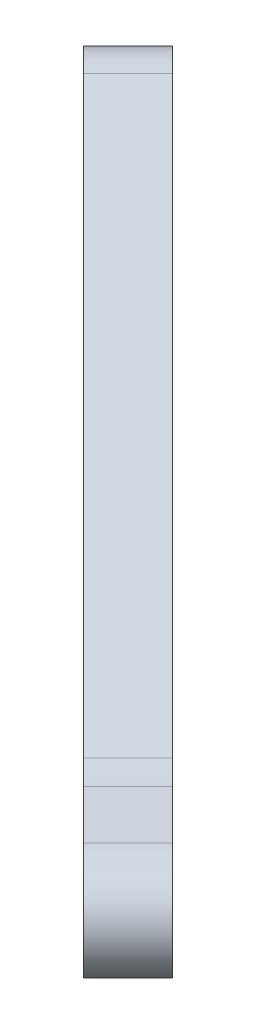
ISO-10303-21;
HEADER;
FILE_DESCRIPTION(('STEP AP214'),'2;1');
FILE_NAME('part.step','',(''),(''),'','','');
FILE_SCHEMA(('AUTOMOTIVE_DESIGN { 1 0 10303 214 1 1 1 1 }'));
ENDSEC;
DATA;
#1=APPLICATION_CONTEXT('core data for automotive mechanical design processes');
#2=APPLICATION_PROTOCOL_DEFINITION('international standard','automotive_design',2000,#1);
#3=PRODUCT_CONTEXT('',#1,'mechanical');
#4=PRODUCT('Part','Part','',(#3));
#5=PRODUCT_RELATED_PRODUCT_CATEGORY('part','',(#4));
#6=PRODUCT_DEFINITION_FORMATION('','',#4);
#7=PRODUCT_DEFINITION_CONTEXT('part definition',#1,'design');
#8=PRODUCT_DEFINITION('design','',#6,#7);
#9=PRODUCT_DEFINITION_SHAPE('','',#8);
#10=(LENGTH_UNIT() NAMED_UNIT(*) SI_UNIT(.MILLI.,.METRE.));
#11=(NAMED_UNIT(*) PLANE_ANGLE_UNIT() SI_UNIT($,.RADIAN.));
#12=(NAMED_UNIT(*) SI_UNIT($,.STERADIAN.) SOLID_ANGLE_UNIT());
#13=UNCERTAINTY_MEASURE_WITH_UNIT(LENGTH_MEASURE(1.E-05),#10,'distance_accuracy_value','');
#14=(GEOMETRIC_REPRESENTATION_CONTEXT(3) GLOBAL_UNCERTAINTY_ASSIGNED_CONTEXT((#13)) GLOBAL_UNIT_ASSIGNED_CONTEXT((#10,
#11,#12)) REPRESENTATION_CONTEXT('',''));
#15=CARTESIAN_POINT('',(0.,0.,0.));
#16=DIRECTION('',(0.,0.,1.));
#17=DIRECTION('',(1.,0.,0.));
#18=AXIS2_PLACEMENT_3D('',#15,#16,#17);
#19=CARTESIAN_POINT('',(-52.7599580016663,-1.60288568297003,29.4826826854525));
#20=DIRECTION('',(0.707106781186551,0.,-0.707106781186544));
#21=DIRECTION('',(-0.707106781186544,0.,-0.707106781186551));
#22=AXIS2_PLACEMENT_3D('',#19,#20,#21);
#23=CYLINDRICAL_SURFACE('',#22,4.);
#24=CARTESIAN_POINT('',(-50.6386376581066,-1.60288568297003,27.3613623418928));
#25=DIRECTION('',(0.707106781186551,0.,-0.707106781186544));
#26=DIRECTION('',(-0.707106781186544,0.,-0.707106781186551));
#27=AXIS2_PLACEMENT_3D('',#24,#25,#26);
#28=CIRCLE('',#27,4.);
#29=CARTESIAN_POINT('',(-52.1460159613578,1.78172970164536,25.8539840386417));
#30=VERTEX_POINT('',#29);
#31=CARTESIAN_POINT('',(-48.2974525519035,0.641597463989556,29.702547448096));
#32=VERTEX_POINT('',#31);
#33=EDGE_CURVE('E155',#30,#32,#28,.T.);
#34=ORIENTED_EDGE('',*,*,#33,.T.);
#35=DIRECTION('',(0.707106781186551,0.,-0.707106781186544));
#36=VECTOR('',#35,1.);
#37=CARTESIAN_POINT('',(-50.4187728954632,0.641597463989555,31.8238677916556));
#38=LINE('',#37,#36);
#39=CARTESIAN_POINT('',(-50.4187728954632,0.641597463989555,31.8238677916556));
#40=VERTEX_POINT('',#39);
#41=EDGE_CURVE('E53',#32,#40,#38,.F.);
#42=ORIENTED_EDGE('',*,*,#41,.T.);
#43=CARTESIAN_POINT('',(-52.7599580016663,-1.60288568297003,29.4826826854525));
#44=DIRECTION('',(0.707106781186551,0.,-0.707106781186544));
#45=DIRECTION('',(-0.707106781186544,0.,-0.707106781186551));
#46=AXIS2_PLACEMENT_3D('',#43,#44,#45);
#47=CIRCLE('',#46,4.);
#48=CARTESIAN_POINT('',(-54.2673363049175,1.78172970164536,27.9753043822013));
#49=VERTEX_POINT('',#48);
#50=EDGE_CURVE('E128',#49,#40,#47,.T.);
#51=ORIENTED_EDGE('',*,*,#50,.F.);
#52=DIRECTION('',(0.707106781186551,0.,-0.707106781186544));
#53=VECTOR('',#52,1.);
#54=CARTESIAN_POINT('',(-54.2673363049175,1.78172970164536,27.9753043822013));
#55=LINE('',#54,#53);
#56=EDGE_CURVE('E117',#49,#30,#55,.T.);
#57=ORIENTED_EDGE('',*,*,#56,.T.);
#58=EDGE_LOOP('',(#34,#42,#51,#57));
#59=FACE_BOUND('',#58,.T.);
#60=ADVANCED_FACE('F38',(#59),#23,.F.);
#61=CARTESIAN_POINT('',(-41.9007915415534,-3.95038970101181,40.3418491455654));
#62=DIRECTION('',(-0.190054282091461,-0.963202335813923,-0.190054282091463));
#63=DIRECTION('',(0.,0.19358259911083,-0.981083980768974));
#64=AXIS2_PLACEMENT_3D('',#61,#62,#63);
#65=PLANE('',#64);
#66=DIRECTION('',(-0.681086903308744,0.268777343320827,-0.681086903308751));
#67=VECTOR('',#66,1.);
#68=CARTESIAN_POINT('',(-39.7794711979938,-3.95038970101181,38.2205288020058));
#69=LINE('',#68,#67);
#70=CARTESIAN_POINT('',(-32.5179305674683,-6.81601167906962,45.4820694325313));
#71=VERTEX_POINT('',#70);
#72=CARTESIAN_POINT('',(-46.321242579607,-1.36881028138058,31.6787574203925));
#73=VERTEX_POINT('',#72);
#74=EDGE_CURVE('E169',#71,#73,#69,.T.);
#75=ORIENTED_EDGE('',*,*,#74,.F.);
#76=DIRECTION('',(0.707106781186551,0.,-0.707106781186544));
#77=VECTOR('',#76,1.);
#78=CARTESIAN_POINT('',(-34.639250911028,-6.81601167906962,47.6033897760909));
#79=LINE('',#78,#77);
#80=CARTESIAN_POINT('',(-34.639250911028,-6.81601167906962,47.6033897760909));
#81=VERTEX_POINT('',#80);
#82=EDGE_CURVE('E197',#71,#81,#79,.F.);
#83=ORIENTED_EDGE('',*,*,#82,.T.);
#84=DIRECTION('',(-0.681086903308744,0.268777343320827,-0.681086903308751));
#85=VECTOR('',#84,1.);
#86=CARTESIAN_POINT('',(-41.9007915415534,-3.95038970101181,40.3418491455654));
#87=LINE('',#86,#85);
#88=CARTESIAN_POINT('',(-48.4425629231667,-1.36881028138058,33.8000777639522));
#89=VERTEX_POINT('',#88);
#90=EDGE_CURVE('E148',#81,#89,#87,.T.);
#91=ORIENTED_EDGE('',*,*,#90,.T.);
#92=DIRECTION('',(-0.707106781186551,0.,0.707106781186544));
#93=VECTOR('',#92,1.);
#94=CARTESIAN_POINT('',(-46.321242579607,-1.36881028138058,31.6787574203925));
#95=LINE('',#94,#93);
#96=EDGE_CURVE('E194',#89,#73,#95,.F.);
#97=ORIENTED_EDGE('',*,*,#96,.T.);
#98=EDGE_LOOP('',(#75,#83,#91,#97));
#99=FACE_BOUND('',#98,.T.);
#100=ADVANCED_FACE('F223',(#99),#65,.T.);
#101=CARTESIAN_POINT('',(-41.1213203435597,-7.,41.1213203435592));
#102=DIRECTION('',(0.,-1.,0.));
#103=DIRECTION('',(0.,0.,-1.));
#104=AXIS2_PLACEMENT_3D('',#101,#102,#103);
#105=PLANE('',#104);
#106=DIRECTION('',(-0.707106781186544,0.,-0.707106781186551));
#107=VECTOR('',#106,1.);
#108=CARTESIAN_POINT('',(-41.1213203435597,-7.,41.1213203435592));
#109=LINE('',#108,#107);
#110=CARTESIAN_POINT('',(-31.3445938794036,-7.,50.8980468077154));
#111=VERTEX_POINT('',#110);
#112=CARTESIAN_POINT('',(-33.6889795005707,-7.,48.5536611865483));
#113=VERTEX_POINT('',#112);
#114=EDGE_CURVE('E145',#111,#113,#109,.T.);
#115=ORIENTED_EDGE('',*,*,#114,.T.);
#116=DIRECTION('',(0.707106781186551,0.,-0.707106781186544));
#117=VECTOR('',#116,1.);
#118=CARTESIAN_POINT('',(-33.6889795005707,-7.,48.5536611865483));
#119=LINE('',#118,#117);
#120=CARTESIAN_POINT('',(-31.567659157011,-7.,46.4323408429886));
#121=VERTEX_POINT('',#120);
#122=EDGE_CURVE('E187',#113,#121,#119,.T.);
#123=ORIENTED_EDGE('',*,*,#122,.T.);
#124=DIRECTION('',(-0.707106781186544,0.,-0.707106781186551));
#125=VECTOR('',#124,1.);
#126=CARTESIAN_POINT('',(-39.,-7.,38.9999999999996));
#127=LINE('',#126,#125);
#128=CARTESIAN_POINT('',(-29.2232735358439,-7.,48.7767264641558));
#129=VERTEX_POINT('',#128);
#130=EDGE_CURVE('E166',#129,#121,#127,.T.);
#131=ORIENTED_EDGE('',*,*,#130,.F.);
#132=DIRECTION('',(0.707106781186551,0.,-0.707106781186544));
#133=VECTOR('',#132,1.);
#134=CARTESIAN_POINT('',(-31.3445938794036,-7.,50.8980468077154));
#135=LINE('',#134,#133);
#136=EDGE_CURVE('E177',#111,#129,#135,.T.);
#137=ORIENTED_EDGE('',*,*,#136,.F.);
#138=EDGE_LOOP('',(#115,#123,#131,#137));
#139=FACE_BOUND('',#138,.T.);
#140=ADVANCED_FACE('F231',(#139),#105,.T.);
#141=CARTESIAN_POINT('',(-31.3445938794036,-4.5,50.8980468077154));
#142=DIRECTION('',(0.707106781186551,0.,-0.707106781186544));
#143=DIRECTION('',(-0.707106781186544,0.,-0.707106781186551));
#144=AXIS2_PLACEMENT_3D('',#141,#142,#143);
#145=CYLINDRICAL_SURFACE('',#144,2.5);
#146=CARTESIAN_POINT('',(-29.2232735358439,-4.5,48.7767264641558));
#147=DIRECTION('',(0.707106781186551,0.,-0.707106781186544));
#148=DIRECTION('',(-0.707106781186544,0.,-0.707106781186551));
#149=AXIS2_PLACEMENT_3D('',#146,#147,#148);
#150=CIRCLE('',#149,2.5);
#151=CARTESIAN_POINT('',(-29.2232735358439,-2.,48.7767264641558));
#152=VERTEX_POINT('',#151);
#153=EDGE_CURVE('E163',#152,#129,#150,.T.);
#154=ORIENTED_EDGE('',*,*,#153,.F.);
#155=DIRECTION('',(0.707106781186551,0.,-0.707106781186544));
#156=VECTOR('',#155,1.);
#157=CARTESIAN_POINT('',(-31.3445938794036,-2.,50.8980468077154));
#158=LINE('',#157,#156);
#159=CARTESIAN_POINT('',(-31.3445938794036,-2.,50.8980468077154));
#160=VERTEX_POINT('',#159);
#161=EDGE_CURVE('E180',#160,#152,#158,.T.);
#162=ORIENTED_EDGE('',*,*,#161,.F.);
#163=CARTESIAN_POINT('',(-31.3445938794036,-4.5,50.8980468077154));
#164=DIRECTION('',(0.707106781186551,0.,-0.707106781186544));
#165=DIRECTION('',(-0.707106781186544,0.,-0.707106781186551));
#166=AXIS2_PLACEMENT_3D('',#163,#164,#165);
#167=CIRCLE('',#166,2.5);
#168=EDGE_CURVE('E142',#160,#111,#167,.T.);
#169=ORIENTED_EDGE('',*,*,#168,.T.);
#170=ORIENTED_EDGE('',*,*,#136,.T.);
#171=EDGE_LOOP('',(#154,#162,#169,#170));
#172=FACE_BOUND('',#171,.T.);
#173=ADVANCED_FACE('F234',(#172),#145,.T.);
#174=CARTESIAN_POINT('',(-41.1213203435597,-2.,41.1213203435592));
#175=DIRECTION('',(0.,-1.,0.));
#176=DIRECTION('',(0.,0.,-1.));
#177=AXIS2_PLACEMENT_3D('',#174,#175,#176);
#178=PLANE('',#177);
#179=DIRECTION('',(-0.707106781186544,0.,-0.707106781186551));
#180=VECTOR('',#179,1.);
#181=CARTESIAN_POINT('',(-39.,-2.,38.9999999999996));
#182=LINE('',#181,#180);
#183=CARTESIAN_POINT('',(-31.5566948650642,-2.,46.4433051349355));
#184=VERTEX_POINT('',#183);
#185=EDGE_CURVE('E160',#152,#184,#182,.T.);
#186=ORIENTED_EDGE('',*,*,#185,.T.);
#187=DIRECTION('',(0.707106781186551,0.,-0.707106781186544));
#188=VECTOR('',#187,1.);
#189=CARTESIAN_POINT('',(-33.6780152086239,-2.,48.5646254784951));
#190=LINE('',#189,#188);
#191=CARTESIAN_POINT('',(-33.6780152086239,-2.,48.5646254784951));
#192=VERTEX_POINT('',#191);
#193=EDGE_CURVE('E185',#184,#192,#190,.F.);
#194=ORIENTED_EDGE('',*,*,#193,.T.);
#195=DIRECTION('',(-0.707106781186544,0.,-0.707106781186551));
#196=VECTOR('',#195,1.);
#197=CARTESIAN_POINT('',(-41.1213203435597,-2.,41.1213203435592));
#198=LINE('',#197,#196);
#199=EDGE_CURVE('E137',#160,#192,#198,.T.);
#200=ORIENTED_EDGE('',*,*,#199,.F.);
#201=ORIENTED_EDGE('',*,*,#161,.T.);
#202=EDGE_LOOP('',(#186,#194,#200,#201));
#203=FACE_BOUND('',#202,.T.);
#204=ADVANCED_FACE('F212',(#203),#178,.F.);
#205=CARTESIAN_POINT('',(-40.9707098485691,0.745739546238239,41.2719308385498));
#206=DIRECTION('',(-0.194195606788689,-0.961548819669571,-0.194195606788691));
#207=DIRECTION('',(0.,0.197964287341307,-0.980209233244336));
#208=AXIS2_PLACEMENT_3D('',#205,#206,#207);
#209=PLANE('',#208);
#210=DIRECTION('',(-0.679917690830271,0.274634060873839,-0.679917690830278));
#211=VECTOR('',#210,1.);
#212=CARTESIAN_POINT('',(-40.9707098485691,0.745739546238239,41.2719308385498));
#213=LINE('',#212,#211);
#214=CARTESIAN_POINT('',(-34.6489932425673,-1.80774409834785,47.5936474445516));
#215=VERTEX_POINT('',#214);
#216=CARTESIAN_POINT('',(-54.7239587274777,6.3009863662039,27.518681959641));
#217=VERTEX_POINT('',#216);
#218=EDGE_CURVE('E134',#215,#217,#213,.T.);
#219=ORIENTED_EDGE('',*,*,#218,.F.);
#220=DIRECTION('',(0.707106781186551,0.,-0.707106781186544));
#221=VECTOR('',#220,1.);
#222=CARTESIAN_POINT('',(-32.5276728990077,-1.80774409834785,45.472327100992));
#223=LINE('',#222,#221);
#224=CARTESIAN_POINT('',(-32.5276728990077,-1.80774409834785,45.472327100992));
#225=VERTEX_POINT('',#224);
#226=EDGE_CURVE('E179',#215,#225,#223,.T.);
#227=ORIENTED_EDGE('',*,*,#226,.T.);
#228=DIRECTION('',(-0.679917690830271,0.274634060873839,-0.679917690830278));
#229=VECTOR('',#228,1.);
#230=CARTESIAN_POINT('',(-38.8493895050094,0.745739546238239,39.1506104949902));
#231=LINE('',#230,#229);
#232=CARTESIAN_POINT('',(-52.6026383839181,6.3009863662039,25.3973616160814));
#233=VERTEX_POINT('',#232);
#234=EDGE_CURVE('E158',#225,#233,#231,.T.);
#235=ORIENTED_EDGE('',*,*,#234,.T.);
#236=DIRECTION('',(0.707106781186551,0.,-0.707106781186544));
#237=VECTOR('',#236,1.);
#238=CARTESIAN_POINT('',(-54.7239587274777,6.3009863662039,27.518681959641));
#239=LINE('',#238,#237);
#240=EDGE_CURVE('E125',#217,#233,#239,.T.);
#241=ORIENTED_EDGE('',*,*,#240,.F.);
#242=EDGE_LOOP('',(#219,#227,#235,#241));
#243=FACE_BOUND('',#242,.T.);
#244=ADVANCED_FACE('F218',(#243),#209,.F.);
#245=CARTESIAN_POINT('',(-31.3445938794036,-4.5,50.8980468077154));
#246=DIRECTION('',(0.707106781186551,0.,-0.707106781186544));
#247=DIRECTION('',(-0.707106781186544,0.,-0.707106781186551));
#248=AXIS2_PLACEMENT_3D('',#245,#246,#247);
#249=CYLINDRICAL_SURFACE('',#248,1.2);
#250=CARTESIAN_POINT('',(-31.3445938794036,-4.5,50.8980468077154));
#251=DIRECTION('',(0.707106781186551,0.,-0.707106781186544));
#252=DIRECTION('',(-0.707106781186544,0.,-0.707106781186551));
#253=AXIS2_PLACEMENT_3D('',#250,#251,#252);
#254=CIRCLE('',#253,1.2);
#255=CARTESIAN_POINT('',(-32.1931220168274,-4.5,50.0495186702915));
#256=VERTEX_POINT('',#255);
#257=EDGE_CURVE('E150',#256,#256,#254,.T.);
#258=CARTESIAN_POINT('',(-29.2232735358439,-4.5,48.7767264641558));
#259=DIRECTION('',(0.707106781186551,0.,-0.707106781186544));
#260=DIRECTION('',(-0.707106781186544,0.,-0.707106781186551));
#261=AXIS2_PLACEMENT_3D('',#258,#259,#260);
#262=CIRCLE('',#261,1.2);
#263=CARTESIAN_POINT('',(-30.0718016732678,-4.5,47.9281983267319));
#264=VERTEX_POINT('',#263);
#265=EDGE_CURVE('E172',#264,#264,#262,.T.);
#266=CARTESIAN_POINT('',(-32.1931220168274,-4.5,50.0495186702915));
#267=CARTESIAN_POINT('',(-32.1710249299154,-4.5,50.0274215833794));
#268=CARTESIAN_POINT('',(-32.1489278430033,-4.5,50.0053244964674));
#269=CARTESIAN_POINT('',(-32.1047336691791,-4.5,49.9611303226432));
#270=CARTESIAN_POINT('',(-32.082636582267,-4.5,49.9390332357311));
#271=CARTESIAN_POINT('',(-32.0384424084429,-4.5,49.894839061907));
#272=CARTESIAN_POINT('',(-32.0163453215308,-4.5,49.8727419749949));
#273=CARTESIAN_POINT('',(-31.9721511477067,-4.5,49.8285478011707));
#274=CARTESIAN_POINT('',(-31.9500540607946,-4.5,49.8064507142587));
#275=CARTESIAN_POINT('',(-31.9058598869704,-4.5,49.7622565404345));
#276=CARTESIAN_POINT('',(-31.8837628000583,-4.5,49.7401594535224));
#277=CARTESIAN_POINT('',(-31.8395686262342,-4.5,49.6959652796983));
#278=CARTESIAN_POINT('',(-31.8174715393221,-4.5,49.6738681927862));
#279=CARTESIAN_POINT('',(-31.7732773654979,-4.5,49.629674018962));
#280=CARTESIAN_POINT('',(-31.7511802785859,-4.5,49.6075769320499));
#281=CARTESIAN_POINT('',(-31.7069861047617,-4.5,49.5633827582258));
#282=CARTESIAN_POINT('',(-31.6848890178496,-4.5,49.5412856713137));
#283=CARTESIAN_POINT('',(-31.6406948440255,-4.5,49.4970914974895));
#284=CARTESIAN_POINT('',(-31.6185977571134,-4.5,49.4749944105775));
#285=CARTESIAN_POINT('',(-31.5744035832892,-4.5,49.4308002367533));
#286=CARTESIAN_POINT('',(-31.5523064963771,-4.5,49.4087031498412));
#287=CARTESIAN_POINT('',(-31.508112322553,-4.5,49.3645089760171));
#288=CARTESIAN_POINT('',(-31.4860152356409,-4.5,49.342411889105));
#289=CARTESIAN_POINT('',(-31.4418210618167,-4.5,49.2982177152808));
#290=CARTESIAN_POINT('',(-31.4197239749047,-4.5,49.2761206283688));
#291=CARTESIAN_POINT('',(-31.3755298010805,-4.5,49.2319264545446));
#292=CARTESIAN_POINT('',(-31.3534327141684,-4.5,49.2098293676325));
#293=CARTESIAN_POINT('',(-31.3092385403443,-4.5,49.1656351938084));
#294=CARTESIAN_POINT('',(-31.2871414534322,-4.5,49.1435381068963));
#295=CARTESIAN_POINT('',(-31.242947279608,-4.5,49.0993439330721));
#296=CARTESIAN_POINT('',(-31.2208501926959,-4.5,49.07724684616));
#297=CARTESIAN_POINT('',(-31.1766560188718,-4.5,49.0330526723359));
#298=CARTESIAN_POINT('',(-31.1545589319597,-4.5,49.0109555854238));
#299=CARTESIAN_POINT('',(-31.1103647581355,-4.5,48.9667614115996));
#300=CARTESIAN_POINT('',(-31.0882676712235,-4.5,48.9446643246876));
#301=CARTESIAN_POINT('',(-31.0440734973993,-4.5,48.9004701508634));
#302=CARTESIAN_POINT('',(-31.0219764104872,-4.5,48.8783730639513));
#303=CARTESIAN_POINT('',(-30.9777822366631,-4.5,48.8341788901272));
#304=CARTESIAN_POINT('',(-30.955685149751,-4.5,48.8120818032151));
#305=CARTESIAN_POINT('',(-30.9114909759268,-4.5,48.7678876293909));
#306=CARTESIAN_POINT('',(-30.8893938890147,-4.5,48.7457905424788));
#307=CARTESIAN_POINT('',(-30.8451997151906,-4.5,48.7015963686547));
#308=CARTESIAN_POINT('',(-30.8231026282785,-4.5,48.6794992817426));
#309=CARTESIAN_POINT('',(-30.7789084544543,-4.5,48.6353051079184));
#310=CARTESIAN_POINT('',(-30.7568113675423,-4.5,48.6132080210064));
#311=CARTESIAN_POINT('',(-30.7126171937181,-4.5,48.5690138471822));
#312=CARTESIAN_POINT('',(-30.690520106806,-4.5,48.5469167602701));
#313=CARTESIAN_POINT('',(-30.6463259329819,-4.5,48.502722586446));
#314=CARTESIAN_POINT('',(-30.6242288460698,-4.5,48.4806254995339));
#315=CARTESIAN_POINT('',(-30.5800346722456,-4.5,48.4364313257097));
#316=CARTESIAN_POINT('',(-30.5579375853335,-4.5,48.4143342387977));
#317=CARTESIAN_POINT('',(-30.5137434115094,-4.5,48.3701400649735));
#318=CARTESIAN_POINT('',(-30.4916463245973,-4.5,48.3480429780614));
#319=CARTESIAN_POINT('',(-30.4474521507732,-4.5,48.3038488042373));
#320=CARTESIAN_POINT('',(-30.4253550638611,-4.5,48.2817517173252));
#321=CARTESIAN_POINT('',(-30.3811608900369,-4.5,48.237557543501));
#322=CARTESIAN_POINT('',(-30.3590638031248,-4.5,48.2154604565889));
#323=CARTESIAN_POINT('',(-30.3148696293007,-4.5,48.1712662827648));
#324=CARTESIAN_POINT('',(-30.2927725423886,-4.5,48.1491691958527));
#325=CARTESIAN_POINT('',(-30.2485783685644,-4.5,48.1049750220285));
#326=CARTESIAN_POINT('',(-30.2264812816524,-4.5,48.0828779351165));
#327=CARTESIAN_POINT('',(-30.1822871078282,-4.5,48.0386837612923));
#328=CARTESIAN_POINT('',(-30.1601900209161,-4.5,48.0165866743802));
#329=CARTESIAN_POINT('',(-30.115995847092,-4.5,47.9723925005561));
#330=CARTESIAN_POINT('',(-30.0938987601799,-4.5,47.950295413644));
#331=CARTESIAN_POINT('',(-30.0718016732678,-4.5,47.9281983267319));
#332=B_SPLINE_CURVE_WITH_KNOTS('',3,(#266,#267,#268,#269,#270,#271,#272,#273,#274,#275,#276,
#277,#278,#279,#280,#281,#282,#283,#284,#285,#286,#287,#288,#289,#290,#291,#292,#293,#294,#295,
#296,#297,#298,#299,#300,#301,#302,#303,#304,#305,#306,#307,#308,#309,#310,#311,#312,#313,#314,
#315,#316,#317,#318,#319,#320,#321,#322,#323,#324,#325,#326,#327,#328,#329,#330,#331),
.UNSPECIFIED.,.F.,.F.,(4,2,2,2,2,2,2,2,2,2,2,2,2,2,2,2,2,2,2,2,2,2,2,2,2,2,2,2,2,2,2,2,4),(0.,
0.0937499999999935,0.187499999999997,0.281249999999995,0.374999999999994,0.468749999999997,
0.562499999999996,0.656249999999994,0.749999999999992,0.843749999999996,0.937499999999999,
1.03124999999999,1.125,1.21874999999999,1.31249999999999,1.40625,1.49999999999999,1.59375,
1.6875,1.78124999999999,1.875,1.96874999999999,2.06249999999999,2.15625,2.24999999999999,
2.34375,2.43749999999999,2.53125,2.625,2.71875,2.8125,2.90624999999999,3.),.UNSPECIFIED.);
#333=EDGE_CURVE('BSEAM310',#256,#264,#332,.T.);
#334=ORIENTED_EDGE('',*,*,#257,.F.);
#335=ORIENTED_EDGE('',*,*,#265,.T.);
#336=ORIENTED_EDGE('',*,*,#333,.T.);
#337=ORIENTED_EDGE('',*,*,#333,.F.);
#338=EDGE_LOOP('',(#334,#336,#335,#337));
#339=FACE_BOUND('',#338,.T.);
#340=ADVANCED_FACE('F310',(#339),#249,.F.);
#341=CARTESIAN_POINT('',(-55.2094477444494,3.89711431702997,27.0331929426693));
#342=DIRECTION('',(0.707106781186551,0.,-0.707106781186544));
#343=DIRECTION('',(-0.707106781186544,0.,-0.707106781186551));
#344=AXIS2_PLACEMENT_3D('',#341,#342,#343);
#345=CYLINDRICAL_SURFACE('',#344,2.5);
#346=CARTESIAN_POINT('',(-53.0881274008898,3.89711431702997,24.9118725991097));
#347=DIRECTION('',(0.707106781186551,0.,-0.707106781186544));
#348=DIRECTION('',(-0.707106781186544,0.,-0.707106781186551));
#349=AXIS2_PLACEMENT_3D('',#346,#347,#348);
#350=CIRCLE('',#349,2.5);
#351=EDGE_CURVE('E123',#30,#233,#350,.T.);
#352=ORIENTED_EDGE('',*,*,#351,.F.);
#353=ORIENTED_EDGE('',*,*,#56,.F.);
#354=CARTESIAN_POINT('',(-55.2094477444494,3.89711431702997,27.0331929426693));
#355=DIRECTION('',(0.707106781186551,0.,-0.707106781186544));
#356=DIRECTION('',(-0.707106781186544,0.,-0.707106781186551));
#357=AXIS2_PLACEMENT_3D('',#354,#355,#356);
#358=CIRCLE('',#357,2.5);
#359=EDGE_CURVE('E121',#49,#217,#358,.T.);
#360=ORIENTED_EDGE('',*,*,#359,.T.);
#361=ORIENTED_EDGE('',*,*,#240,.T.);
#362=EDGE_LOOP('',(#352,#353,#360,#361));
#363=FACE_BOUND('',#362,.T.);
#364=ADVANCED_FACE('F118',(#363),#345,.T.);
#365=CARTESIAN_POINT('',(-55.2094477444494,3.89711431702997,27.0331929426693));
#366=DIRECTION('',(0.707106781186551,0.,-0.707106781186544));
#367=DIRECTION('',(-0.707106781186544,0.,-0.707106781186551));
#368=AXIS2_PLACEMENT_3D('',#365,#366,#367);
#369=CYLINDRICAL_SURFACE('',#368,1.2);
#370=CARTESIAN_POINT('',(-55.2094477444494,3.89711431702997,27.0331929426693));
#371=DIRECTION('',(0.707106781186551,0.,-0.707106781186544));
#372=DIRECTION('',(-0.707106781186544,0.,-0.707106781186551));
#373=AXIS2_PLACEMENT_3D('',#370,#371,#372);
#374=CIRCLE('',#373,1.2);
#375=CARTESIAN_POINT('',(-56.0579758818733,3.89711431702997,26.1846648052454));
#376=VERTEX_POINT('',#375);
#377=EDGE_CURVE('E126',#376,#376,#374,.T.);
#378=CARTESIAN_POINT('',(-53.0881274008898,3.89711431702997,24.9118725991097));
#379=DIRECTION('',(0.707106781186551,0.,-0.707106781186544));
#380=DIRECTION('',(-0.707106781186544,0.,-0.707106781186551));
#381=AXIS2_PLACEMENT_3D('',#378,#379,#380);
#382=CIRCLE('',#381,1.2);
#383=CARTESIAN_POINT('',(-53.9366555383136,3.89711431702997,24.0633444616858));
#384=VERTEX_POINT('',#383);
#385=EDGE_CURVE('E129',#384,#384,#382,.T.);
#386=CARTESIAN_POINT('',(-56.0579758818733,3.89711431702997,26.1846648052454));
#387=CARTESIAN_POINT('',(-56.0358787949612,3.89711431702997,26.1625677183334));
#388=CARTESIAN_POINT('',(-56.0137817080491,3.89711431702997,26.1404706314213));
#389=CARTESIAN_POINT('',(-55.969587534225,3.89711431702997,26.0962764575971));
#390=CARTESIAN_POINT('',(-55.9474904473129,3.89711431702997,26.074179370685));
#391=CARTESIAN_POINT('',(-55.9032962734887,3.89711431702997,26.0299851968609));
#392=CARTESIAN_POINT('',(-55.8811991865767,3.89711431702997,26.0078881099488));
#393=CARTESIAN_POINT('',(-55.8370050127525,3.89711431702997,25.9636939361246));
#394=CARTESIAN_POINT('',(-55.8149079258404,3.89711431702997,25.9415968492126));
#395=CARTESIAN_POINT('',(-55.7707137520163,3.89711431702997,25.8974026753884));
#396=CARTESIAN_POINT('',(-55.7486166651042,3.89711431702997,25.8753055884763));
#397=CARTESIAN_POINT('',(-55.70442249128,3.89711431702997,25.8311114146522));
#398=CARTESIAN_POINT('',(-55.6823254043679,3.89711431702997,25.8090143277401));
#399=CARTESIAN_POINT('',(-55.6381312305438,3.89711431702997,25.7648201539159));
#400=CARTESIAN_POINT('',(-55.6160341436317,3.89711431702997,25.7427230670038));
#401=CARTESIAN_POINT('',(-55.5718399698075,3.89711431702997,25.6985288931797));
#402=CARTESIAN_POINT('',(-55.5497428828955,3.89711431702997,25.6764318062676));
#403=CARTESIAN_POINT('',(-55.5055487090713,3.89711431702997,25.6322376324435));
#404=CARTESIAN_POINT('',(-55.4834516221592,3.89711431702997,25.6101405455314));
#405=CARTESIAN_POINT('',(-55.4392574483351,3.89711431702997,25.5659463717072));
#406=CARTESIAN_POINT('',(-55.417160361423,3.89711431702997,25.5438492847951));
#407=CARTESIAN_POINT('',(-55.3729661875988,3.89711431702997,25.499655110971));
#408=CARTESIAN_POINT('',(-55.3508691006868,3.89711431702997,25.4775580240589));
#409=CARTESIAN_POINT('',(-55.3066749268626,3.89711431702997,25.4333638502347));
#410=CARTESIAN_POINT('',(-55.2845778399505,3.89711431702997,25.4112667633227));
#411=CARTESIAN_POINT('',(-55.2403836661264,3.89711431702997,25.3670725894985));
#412=CARTESIAN_POINT('',(-55.2182865792143,3.89711431702997,25.3449755025864));
#413=CARTESIAN_POINT('',(-55.1740924053901,3.89711431702997,25.3007813287623));
#414=CARTESIAN_POINT('',(-55.151995318478,3.89711431702997,25.2786842418502));
#415=CARTESIAN_POINT('',(-55.1078011446539,3.89711431702997,25.234490068026));
#416=CARTESIAN_POINT('',(-55.0857040577418,3.89711431702997,25.2123929811139));
#417=CARTESIAN_POINT('',(-55.0415098839176,3.89711431702997,25.1681988072898));
#418=CARTESIAN_POINT('',(-55.0194127970056,3.89711431702997,25.1461017203777));
#419=CARTESIAN_POINT('',(-54.9752186231814,3.89711431702997,25.1019075465535));
#420=CARTESIAN_POINT('',(-54.9531215362693,3.89711431702997,25.0798104596415));
#421=CARTESIAN_POINT('',(-54.9089273624452,3.89711431702997,25.0356162858173));
#422=CARTESIAN_POINT('',(-54.8868302755331,3.89711431702997,25.0135191989052));
#423=CARTESIAN_POINT('',(-54.8426361017089,3.89711431702997,24.9693250250811));
#424=CARTESIAN_POINT('',(-54.8205390147968,3.89711431702997,24.947227938169));
#425=CARTESIAN_POINT('',(-54.7763448409727,3.89711431702997,24.9030337643448));
#426=CARTESIAN_POINT('',(-54.7542477540606,3.89711431702997,24.8809366774327));
#427=CARTESIAN_POINT('',(-54.7100535802364,3.89711431702997,24.8367425036086));
#428=CARTESIAN_POINT('',(-54.6879564933244,3.89711431702997,24.8146454166965));
#429=CARTESIAN_POINT('',(-54.6437623195002,3.89711431702997,24.7704512428724));
#430=CARTESIAN_POINT('',(-54.6216652325881,3.89711431702997,24.7483541559603));
#431=CARTESIAN_POINT('',(-54.577471058764,3.89711431702997,24.7041599821361));
#432=CARTESIAN_POINT('',(-54.5553739718519,3.89711431702997,24.682062895224));
#433=CARTESIAN_POINT('',(-54.5111797980277,3.89711431702997,24.6378687213999));
#434=CARTESIAN_POINT('',(-54.4890827111156,3.89711431702997,24.6157716344878));
#435=CARTESIAN_POINT('',(-54.4448885372915,3.89711431702997,24.5715774606636));
#436=CARTESIAN_POINT('',(-54.4227914503794,3.89711431702997,24.5494803737516));
#437=CARTESIAN_POINT('',(-54.3785972765552,3.89711431702997,24.5052861999274));
#438=CARTESIAN_POINT('',(-54.3565001896432,3.89711431702997,24.4831891130153));
#439=CARTESIAN_POINT('',(-54.312306015819,3.89711431702997,24.4389949391912));
#440=CARTESIAN_POINT('',(-54.2902089289069,3.89711431702997,24.4168978522791));
#441=CARTESIAN_POINT('',(-54.2460147550828,3.89711431702997,24.3727036784549));
#442=CARTESIAN_POINT('',(-54.2239176681707,3.89711431702997,24.3506065915428));
#443=CARTESIAN_POINT('',(-54.1797234943465,3.89711431702997,24.3064124177187));
#444=CARTESIAN_POINT('',(-54.1576264074344,3.89711431702997,24.2843153308066));
#445=CARTESIAN_POINT('',(-54.1134322336103,3.89711431702997,24.2401211569824));
#446=CARTESIAN_POINT('',(-54.0913351466982,3.89711431702997,24.2180240700704));
#447=CARTESIAN_POINT('',(-54.047140972874,3.89711431702997,24.1738298962462));
#448=CARTESIAN_POINT('',(-54.025043885962,3.89711431702997,24.1517328093341));
#449=CARTESIAN_POINT('',(-53.9808497121378,3.89711431702997,24.10753863551));
#450=CARTESIAN_POINT('',(-53.9587526252257,3.89711431702997,24.0854415485979));
#451=CARTESIAN_POINT('',(-53.9366555383136,3.89711431702997,24.0633444616858));
#452=B_SPLINE_CURVE_WITH_KNOTS('',3,(#386,#387,#388,#389,#390,#391,#392,#393,#394,#395,#396,
#397,#398,#399,#400,#401,#402,#403,#404,#405,#406,#407,#408,#409,#410,#411,#412,#413,#414,#415,
#416,#417,#418,#419,#420,#421,#422,#423,#424,#425,#426,#427,#428,#429,#430,#431,#432,#433,#434,
#435,#436,#437,#438,#439,#440,#441,#442,#443,#444,#445,#446,#447,#448,#449,#450,#451),
.UNSPECIFIED.,.F.,.F.,(4,2,2,2,2,2,2,2,2,2,2,2,2,2,2,2,2,2,2,2,2,2,2,2,2,2,2,2,2,2,2,2,4),(0.,
0.093749999999996,0.187499999999997,0.281249999999998,0.374999999999999,0.468749999999997,
0.562499999999998,0.656249999999999,0.749999999999995,0.843749999999996,0.937499999999999,
1.03125,1.125,1.21875,1.3125,1.40625,1.5,1.59375,1.6875,1.78125,1.875,1.96875,2.0625,2.15625,
2.25,2.34375,2.4375,2.53125,2.625,2.71875,2.8125,2.90625,3.),.UNSPECIFIED.);
#453=EDGE_CURVE('BSEAM292',#376,#384,#452,.T.);
#454=ORIENTED_EDGE('',*,*,#377,.F.);
#455=ORIENTED_EDGE('',*,*,#385,.T.);
#456=ORIENTED_EDGE('',*,*,#453,.T.);
#457=ORIENTED_EDGE('',*,*,#453,.F.);
#458=EDGE_LOOP('',(#454,#456,#455,#457));
#459=FACE_BOUND('',#458,.T.);
#460=ADVANCED_FACE('F292',(#459),#369,.F.);
#461=CARTESIAN_POINT('',(-41.1213203435597,0.,41.1213203435592));
#462=DIRECTION('',(0.707106781186551,0.,-0.707106781186544));
#463=DIRECTION('',(-0.707106781186544,0.,-0.707106781186551));
#464=AXIS2_PLACEMENT_3D('',#461,#462,#463);
#465=PLANE('',#464);
#466=ORIENTED_EDGE('',*,*,#90,.F.);
#467=CARTESIAN_POINT('',(-33.6889795005707,-2.,48.5536611865483));
#468=DIRECTION('',(0.707106781186551,0.,-0.707106781186544));
#469=DIRECTION('',(-0.707106781186544,0.,-0.707106781186551));
#470=AXIS2_PLACEMENT_3D('',#467,#468,#469);
#471=CIRCLE('',#470,5.);
#472=EDGE_CURVE('E200',#81,#113,#471,.F.);
#473=ORIENTED_EDGE('',*,*,#472,.T.);
#474=ORIENTED_EDGE('',*,*,#114,.F.);
#475=ORIENTED_EDGE('',*,*,#168,.F.);
#476=ORIENTED_EDGE('',*,*,#199,.T.);
#477=CARTESIAN_POINT('',(-33.6780152086239,3.,48.5646254784951));
#478=DIRECTION('',(0.707106781186551,0.,-0.707106781186544));
#479=DIRECTION('',(-0.707106781186544,0.,-0.707106781186551));
#480=AXIS2_PLACEMENT_3D('',#477,#478,#479);
#481=CIRCLE('',#480,5.);
#482=EDGE_CURVE('E11',#192,#215,#481,.T.);
#483=ORIENTED_EDGE('',*,*,#482,.T.);
#484=ORIENTED_EDGE('',*,*,#218,.T.);
#485=ORIENTED_EDGE('',*,*,#359,.F.);
#486=ORIENTED_EDGE('',*,*,#50,.T.);
#487=CARTESIAN_POINT('',(-47.4922915127093,3.44720139768904,34.7503491744095));
#488=DIRECTION('',(0.707106781186551,0.,-0.707106781186544));
#489=DIRECTION('',(-0.707106781186544,0.,-0.707106781186551));
#490=AXIS2_PLACEMENT_3D('',#487,#488,#489);
#491=CIRCLE('',#490,5.);
#492=EDGE_CURVE('E60',#40,#89,#491,.F.);
#493=ORIENTED_EDGE('',*,*,#492,.T.);
#494=EDGE_LOOP('',(#466,#473,#474,#475,#476,#483,#484,#485,#486,#493));
#495=FACE_BOUND('',#494,.T.);
#496=ORIENTED_EDGE('',*,*,#257,.T.);
#497=EDGE_LOOP('',(#496));
#498=FACE_BOUND('',#497,.T.);
#499=ORIENTED_EDGE('',*,*,#377,.T.);
#500=EDGE_LOOP('',(#499));
#501=FACE_BOUND('',#500,.T.);
#502=ADVANCED_FACE('F131',(#495,#498,#501),#465,.F.);
#503=CARTESIAN_POINT('',(-39.,0.,38.9999999999996));
#504=DIRECTION('',(0.707106781186551,0.,-0.707106781186544));
#505=DIRECTION('',(-0.707106781186544,0.,-0.707106781186551));
#506=AXIS2_PLACEMENT_3D('',#503,#504,#505);
#507=PLANE('',#506);
#508=ORIENTED_EDGE('',*,*,#130,.T.);
#509=CARTESIAN_POINT('',(-31.567659157011,-2.,46.4323408429886));
#510=DIRECTION('',(0.707106781186551,0.,-0.707106781186544));
#511=DIRECTION('',(-0.707106781186544,0.,-0.707106781186551));
#512=AXIS2_PLACEMENT_3D('',#509,#510,#511);
#513=CIRCLE('',#512,5.);
#514=EDGE_CURVE('E192',#121,#71,#513,.T.);
#515=ORIENTED_EDGE('',*,*,#514,.T.);
#516=ORIENTED_EDGE('',*,*,#74,.T.);
#517=CARTESIAN_POINT('',(-45.3709711691497,3.44720139768904,32.6290288308498));
#518=DIRECTION('',(0.707106781186551,0.,-0.707106781186544));
#519=DIRECTION('',(-0.707106781186544,0.,-0.707106781186551));
#520=AXIS2_PLACEMENT_3D('',#517,#518,#519);
#521=CIRCLE('',#520,5.);
#522=EDGE_CURVE('E190',#73,#32,#521,.T.);
#523=ORIENTED_EDGE('',*,*,#522,.T.);
#524=ORIENTED_EDGE('',*,*,#33,.F.);
#525=ORIENTED_EDGE('',*,*,#351,.T.);
#526=ORIENTED_EDGE('',*,*,#234,.F.);
#527=CARTESIAN_POINT('',(-31.5566948650642,3.,46.4433051349355));
#528=DIRECTION('',(0.707106781186551,0.,-0.707106781186544));
#529=DIRECTION('',(-0.707106781186544,0.,-0.707106781186551));
#530=AXIS2_PLACEMENT_3D('',#527,#528,#529);
#531=CIRCLE('',#530,5.);
#532=EDGE_CURVE('E46',#225,#184,#531,.F.);
#533=ORIENTED_EDGE('',*,*,#532,.T.);
#534=ORIENTED_EDGE('',*,*,#185,.F.);
#535=ORIENTED_EDGE('',*,*,#153,.T.);
#536=EDGE_LOOP('',(#508,#515,#516,#523,#524,#525,#526,#533,#534,#535));
#537=FACE_BOUND('',#536,.T.);
#538=ORIENTED_EDGE('',*,*,#265,.F.);
#539=EDGE_LOOP('',(#538));
#540=FACE_BOUND('',#539,.T.);
#541=ORIENTED_EDGE('',*,*,#385,.F.);
#542=EDGE_LOOP('',(#541));
#543=FACE_BOUND('',#542,.T.);
#544=ADVANCED_FACE('F205',(#537,#540,#543),#507,.T.);
#545=CARTESIAN_POINT('',(-33.6780152086239,3.,48.5646254784951));
#546=DIRECTION('',(-0.707106781186551,0.,0.707106781186544));
#547=DIRECTION('',(0.707106781186544,0.,0.707106781186551));
#548=AXIS2_PLACEMENT_3D('',#545,#546,#547);
#549=CYLINDRICAL_SURFACE('',#548,5.);
#550=ORIENTED_EDGE('',*,*,#482,.F.);
#551=ORIENTED_EDGE('',*,*,#193,.F.);
#552=ORIENTED_EDGE('',*,*,#532,.F.);
#553=ORIENTED_EDGE('',*,*,#226,.F.);
#554=EDGE_LOOP('',(#550,#551,#552,#553));
#555=FACE_BOUND('',#554,.T.);
#556=ADVANCED_FACE('F215',(#555),#549,.F.);
#557=CARTESIAN_POINT('',(-33.6889795005707,-2.,48.5536611865483));
#558=DIRECTION('',(0.707106781186551,0.,-0.707106781186544));
#559=DIRECTION('',(-0.707106781186544,0.,-0.707106781186551));
#560=AXIS2_PLACEMENT_3D('',#557,#558,#559);
#561=CYLINDRICAL_SURFACE('',#560,5.);
#562=ORIENTED_EDGE('',*,*,#472,.F.);
#563=ORIENTED_EDGE('',*,*,#82,.F.);
#564=ORIENTED_EDGE('',*,*,#514,.F.);
#565=ORIENTED_EDGE('',*,*,#122,.F.);
#566=EDGE_LOOP('',(#562,#563,#564,#565));
#567=FACE_BOUND('',#566,.T.);
#568=ADVANCED_FACE('F229',(#567),#561,.T.);
#569=CARTESIAN_POINT('',(-47.4922915127093,3.44720139768904,34.7503491744095));
#570=DIRECTION('',(0.707106781186551,0.,-0.707106781186544));
#571=DIRECTION('',(-0.707106781186544,0.,-0.707106781186551));
#572=AXIS2_PLACEMENT_3D('',#569,#570,#571);
#573=CYLINDRICAL_SURFACE('',#572,5.);
#574=ORIENTED_EDGE('',*,*,#492,.F.);
#575=ORIENTED_EDGE('',*,*,#41,.F.);
#576=ORIENTED_EDGE('',*,*,#522,.F.);
#577=ORIENTED_EDGE('',*,*,#96,.F.);
#578=EDGE_LOOP('',(#574,#575,#576,#577));
#579=FACE_BOUND('',#578,.T.);
#580=ADVANCED_FACE('F40',(#579),#573,.T.);
#581=CLOSED_SHELL('',(#60,#100,#140,#173,#204,#244,#340,#364,#460,#502,#544,#556,#568,#580));
#582=MANIFOLD_SOLID_BREP('B2',#581);
#583=ADVANCED_BREP_SHAPE_REPRESENTATION('',(#18,#582),#14);
#584=SHAPE_DEFINITION_REPRESENTATION(#9,#583);
ENDSEC;
END-ISO-10303-21;
